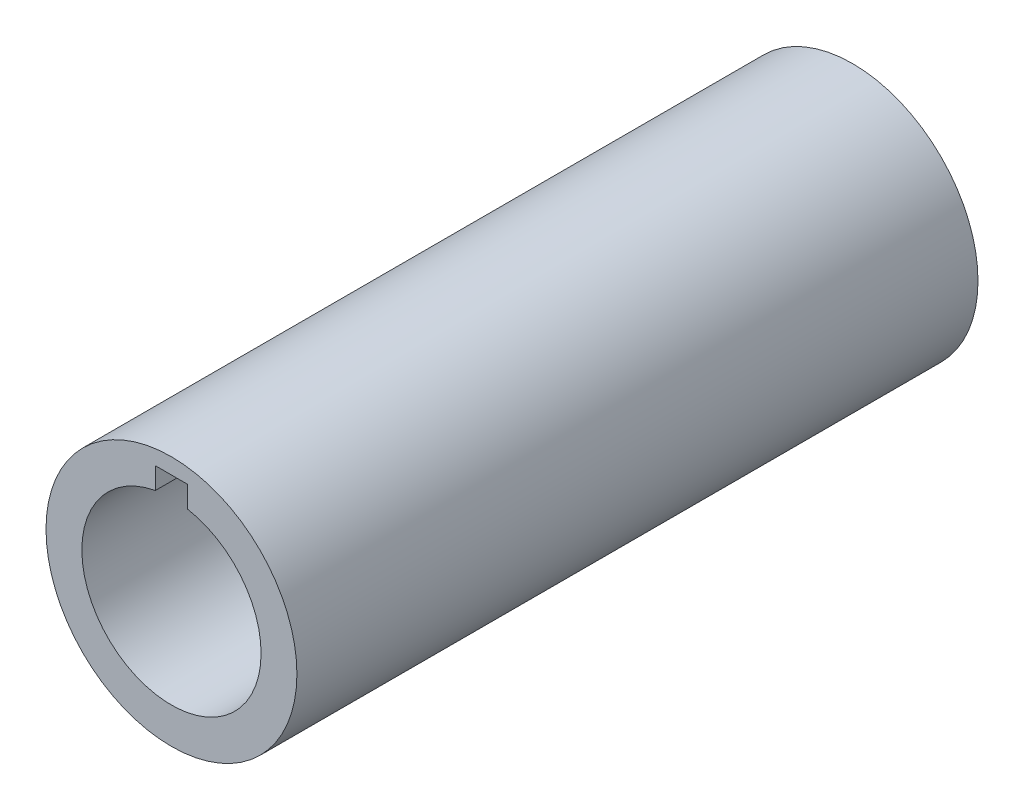
ISO-10303-21;
HEADER;
FILE_DESCRIPTION(('STEP AP214'),'2;1');
FILE_NAME('part.step','',(''),(''),'','','');
FILE_SCHEMA(('AUTOMOTIVE_DESIGN { 1 0 10303 214 1 1 1 1 }'));
ENDSEC;
DATA;
#1=APPLICATION_CONTEXT('core data for automotive mechanical design processes');
#2=APPLICATION_PROTOCOL_DEFINITION('international standard','automotive_design',2000,#1);
#3=PRODUCT_CONTEXT('',#1,'mechanical');
#4=PRODUCT('Part','Part','',(#3));
#5=PRODUCT_RELATED_PRODUCT_CATEGORY('part','',(#4));
#6=PRODUCT_DEFINITION_FORMATION('','',#4);
#7=PRODUCT_DEFINITION_CONTEXT('part definition',#1,'design');
#8=PRODUCT_DEFINITION('design','',#6,#7);
#9=PRODUCT_DEFINITION_SHAPE('','',#8);
#10=(LENGTH_UNIT() NAMED_UNIT(*) SI_UNIT(.MILLI.,.METRE.));
#11=(NAMED_UNIT(*) PLANE_ANGLE_UNIT() SI_UNIT($,.RADIAN.));
#12=(NAMED_UNIT(*) SI_UNIT($,.STERADIAN.) SOLID_ANGLE_UNIT());
#13=UNCERTAINTY_MEASURE_WITH_UNIT(LENGTH_MEASURE(1.E-05),#10,'distance_accuracy_value','');
#14=(GEOMETRIC_REPRESENTATION_CONTEXT(3) GLOBAL_UNCERTAINTY_ASSIGNED_CONTEXT((#13)) GLOBAL_UNIT_ASSIGNED_CONTEXT((#10,
#11,#12)) REPRESENTATION_CONTEXT('',''));
#15=CARTESIAN_POINT('',(0.,0.,0.));
#16=DIRECTION('',(0.,0.,1.));
#17=DIRECTION('',(1.,0.,0.));
#18=AXIS2_PLACEMENT_3D('',#15,#16,#17);
#19=CARTESIAN_POINT('',(-55.1207524379169,48.9482308747321,0.));
#20=DIRECTION('',(0.,0.,1.));
#21=DIRECTION('',(1.,0.,0.));
#22=AXIS2_PLACEMENT_3D('',#19,#20,#21);
#23=PLANE('',#22);
#24=CARTESIAN_POINT('',(-55.1207524379169,48.9482308747321,0.));
#25=DIRECTION('',(0.,0.,1.));
#26=DIRECTION('',(1.,0.,0.));
#27=AXIS2_PLACEMENT_3D('',#24,#25,#26);
#28=CIRCLE('',#27,3.5);
#29=CARTESIAN_POINT('',(-51.6207524379169,48.9482308747321,0.));
#30=VERTEX_POINT('',#29);
#31=EDGE_CURVE('E11',#30,#30,#28,.T.);
#32=ORIENTED_EDGE('',*,*,#31,.F.);
#33=EDGE_LOOP('',(#32));
#34=FACE_BOUND('',#33,.T.);
#35=CARTESIAN_POINT('',(-55.1207524379169,48.9482308747321,0.));
#36=DIRECTION('',(0.,0.,1.));
#37=DIRECTION('',(1.,0.,0.));
#38=AXIS2_PLACEMENT_3D('',#35,#36,#37);
#39=CIRCLE('',#38,2.5);
#40=CARTESIAN_POINT('',(-54.6707524379169,46.4890643492605,0.));
#41=VERTEX_POINT('',#40);
#42=CARTESIAN_POINT('',(-55.5707524379169,46.4890643492605,0.));
#43=VERTEX_POINT('',#42);
#44=EDGE_CURVE('E146',#41,#43,#39,.T.);
#45=ORIENTED_EDGE('',*,*,#44,.T.);
#46=DIRECTION('',(0.,1.,0.));
#47=VECTOR('',#46,1.);
#48=CARTESIAN_POINT('',(-55.5707524379169,46.4890643492605,0.));
#49=LINE('',#48,#47);
#50=CARTESIAN_POINT('',(-55.5707524379169,47.0890643492605,0.));
#51=VERTEX_POINT('',#50);
#52=EDGE_CURVE('E163',#43,#51,#49,.T.);
#53=ORIENTED_EDGE('',*,*,#52,.T.);
#54=DIRECTION('',(1.,0.,0.));
#55=VECTOR('',#54,1.);
#56=CARTESIAN_POINT('',(-55.5707524379169,47.0890643492605,0.));
#57=LINE('',#56,#55);
#58=CARTESIAN_POINT('',(-54.6707524379169,47.0890643492605,0.));
#59=VERTEX_POINT('',#58);
#60=EDGE_CURVE('E166',#51,#59,#57,.T.);
#61=ORIENTED_EDGE('',*,*,#60,.T.);
#62=DIRECTION('',(0.,-1.,0.));
#63=VECTOR('',#62,1.);
#64=CARTESIAN_POINT('',(-54.6707524379169,47.0890643492605,0.));
#65=LINE('',#64,#63);
#66=EDGE_CURVE('E151',#59,#41,#65,.T.);
#67=ORIENTED_EDGE('',*,*,#66,.T.);
#68=EDGE_LOOP('',(#45,#53,#61,#67));
#69=FACE_BOUND('',#68,.T.);
#70=ADVANCED_FACE('F43',(#34,#69),#23,.F.);
#71=CARTESIAN_POINT('',(-55.1207524379169,48.9482308747321,8.));
#72=DIRECTION('',(0.,0.,-1.));
#73=DIRECTION('',(-1.,0.,0.));
#74=AXIS2_PLACEMENT_3D('',#71,#72,#73);
#75=CYLINDRICAL_SURFACE('',#74,3.5);
#76=ORIENTED_EDGE('',*,*,#31,.T.);
#77=EDGE_LOOP('',(#76));
#78=FACE_BOUND('',#77,.T.);
#79=CARTESIAN_POINT('',(-55.1207524379169,48.9482308747321,19.));
#80=DIRECTION('',(0.,0.,1.));
#81=DIRECTION('',(1.,0.,0.));
#82=AXIS2_PLACEMENT_3D('',#79,#80,#81);
#83=CIRCLE('',#82,3.50000000000001);
#84=CARTESIAN_POINT('',(-51.6207524379169,48.9482308747321,19.));
#85=VERTEX_POINT('',#84);
#86=EDGE_CURVE('E122',#85,#85,#83,.T.);
#87=ORIENTED_EDGE('',*,*,#86,.F.);
#88=EDGE_LOOP('',(#87));
#89=FACE_BOUND('',#88,.T.);
#90=ADVANCED_FACE('F45',(#78,#89),#75,.T.);
#91=CARTESIAN_POINT('',(-55.1207524379169,48.9482308747321,8.));
#92=DIRECTION('',(0.,0.,-1.));
#93=DIRECTION('',(-1.,0.,0.));
#94=AXIS2_PLACEMENT_3D('',#91,#92,#93);
#95=CYLINDRICAL_SURFACE('',#94,2.5);
#96=ORIENTED_EDGE('',*,*,#44,.F.);
#97=DIRECTION('',(0.,0.,-1.));
#98=VECTOR('',#97,1.);
#99=CARTESIAN_POINT('',(-54.6707524379169,46.4890643492605,8.));
#100=LINE('',#99,#98);
#101=CARTESIAN_POINT('',(-54.6707524379169,46.4890643492605,8.));
#102=VERTEX_POINT('',#101);
#103=EDGE_CURVE('E160',#102,#41,#100,.T.);
#104=ORIENTED_EDGE('',*,*,#103,.F.);
#105=CARTESIAN_POINT('',(-55.1207524379169,48.9482308747321,8.));
#106=DIRECTION('',(0.,0.,1.));
#107=DIRECTION('',(1.,0.,0.));
#108=AXIS2_PLACEMENT_3D('',#105,#106,#107);
#109=CIRCLE('',#108,2.5);
#110=CARTESIAN_POINT('',(-55.5707524379169,46.4890643492605,8.));
#111=VERTEX_POINT('',#110);
#112=EDGE_CURVE('E147',#102,#111,#109,.T.);
#113=ORIENTED_EDGE('',*,*,#112,.T.);
#114=DIRECTION('',(0.,0.,-1.));
#115=VECTOR('',#114,1.);
#116=CARTESIAN_POINT('',(-55.5707524379169,46.4890643492605,8.));
#117=LINE('',#116,#115);
#118=EDGE_CURVE('E51',#111,#43,#117,.T.);
#119=ORIENTED_EDGE('',*,*,#118,.T.);
#120=EDGE_LOOP('',(#96,#104,#113,#119));
#121=FACE_BOUND('',#120,.T.);
#122=ADVANCED_FACE('F179',(#121),#95,.F.);
#123=CARTESIAN_POINT('',(-55.5707524379169,46.4890643492605,8.));
#124=DIRECTION('',(-1.,0.,0.));
#125=DIRECTION('',(0.,0.,1.));
#126=AXIS2_PLACEMENT_3D('',#123,#124,#125);
#127=PLANE('',#126);
#128=ORIENTED_EDGE('',*,*,#52,.F.);
#129=ORIENTED_EDGE('',*,*,#118,.F.);
#130=DIRECTION('',(0.,1.,0.));
#131=VECTOR('',#130,1.);
#132=CARTESIAN_POINT('',(-55.5707524379169,46.4890643492605,8.));
#133=LINE('',#132,#131);
#134=CARTESIAN_POINT('',(-55.5707524379169,47.0890643492605,8.));
#135=VERTEX_POINT('',#134);
#136=EDGE_CURVE('E150',#111,#135,#133,.T.);
#137=ORIENTED_EDGE('',*,*,#136,.T.);
#138=DIRECTION('',(0.,0.,-1.));
#139=VECTOR('',#138,1.);
#140=CARTESIAN_POINT('',(-55.5707524379169,47.0890643492605,8.));
#141=LINE('',#140,#139);
#142=EDGE_CURVE('E175',#135,#51,#141,.T.);
#143=ORIENTED_EDGE('',*,*,#142,.T.);
#144=EDGE_LOOP('',(#128,#129,#137,#143));
#145=FACE_BOUND('',#144,.T.);
#146=ADVANCED_FACE('F191',(#145),#127,.T.);
#147=CARTESIAN_POINT('',(-55.5707524379169,47.0890643492605,8.));
#148=DIRECTION('',(0.,1.,0.));
#149=DIRECTION('',(0.,0.,1.));
#150=AXIS2_PLACEMENT_3D('',#147,#148,#149);
#151=PLANE('',#150);
#152=ORIENTED_EDGE('',*,*,#60,.F.);
#153=ORIENTED_EDGE('',*,*,#142,.F.);
#154=DIRECTION('',(1.,0.,0.));
#155=VECTOR('',#154,1.);
#156=CARTESIAN_POINT('',(-55.5707524379169,47.0890643492605,8.));
#157=LINE('',#156,#155);
#158=CARTESIAN_POINT('',(-54.6707524379169,47.0890643492605,8.));
#159=VERTEX_POINT('',#158);
#160=EDGE_CURVE('E154',#135,#159,#157,.T.);
#161=ORIENTED_EDGE('',*,*,#160,.T.);
#162=DIRECTION('',(0.,0.,-1.));
#163=VECTOR('',#162,1.);
#164=CARTESIAN_POINT('',(-54.6707524379169,47.0890643492605,8.));
#165=LINE('',#164,#163);
#166=EDGE_CURVE('E173',#159,#59,#165,.T.);
#167=ORIENTED_EDGE('',*,*,#166,.T.);
#168=EDGE_LOOP('',(#152,#153,#161,#167));
#169=FACE_BOUND('',#168,.T.);
#170=ADVANCED_FACE('F193',(#169),#151,.T.);
#171=CARTESIAN_POINT('',(-54.6707524379169,47.0890643492605,8.));
#172=DIRECTION('',(1.,0.,0.));
#173=DIRECTION('',(0.,0.,-1.));
#174=AXIS2_PLACEMENT_3D('',#171,#172,#173);
#175=PLANE('',#174);
#176=ORIENTED_EDGE('',*,*,#66,.F.);
#177=ORIENTED_EDGE('',*,*,#166,.F.);
#178=DIRECTION('',(0.,-1.,0.));
#179=VECTOR('',#178,1.);
#180=CARTESIAN_POINT('',(-54.6707524379169,47.0890643492605,8.));
#181=LINE('',#180,#179);
#182=EDGE_CURVE('E157',#159,#102,#181,.T.);
#183=ORIENTED_EDGE('',*,*,#182,.T.);
#184=ORIENTED_EDGE('',*,*,#103,.T.);
#185=EDGE_LOOP('',(#176,#177,#183,#184));
#186=FACE_BOUND('',#185,.T.);
#187=ADVANCED_FACE('F187',(#186),#175,.T.);
#188=CARTESIAN_POINT('',(-55.1207524379169,48.9482308747321,8.));
#189=DIRECTION('',(0.,0.,1.));
#190=DIRECTION('',(1.,0.,0.));
#191=AXIS2_PLACEMENT_3D('',#188,#189,#190);
#192=PLANE('',#191);
#193=ORIENTED_EDGE('',*,*,#136,.F.);
#194=ORIENTED_EDGE('',*,*,#112,.F.);
#195=ORIENTED_EDGE('',*,*,#182,.F.);
#196=ORIENTED_EDGE('',*,*,#160,.F.);
#197=EDGE_LOOP('',(#193,#194,#195,#196));
#198=FACE_BOUND('',#197,.T.);
#199=ADVANCED_FACE('F189',(#198),#192,.F.);
#200=CARTESIAN_POINT('',(-55.1207524379169,48.9482308747321,19.));
#201=DIRECTION('',(0.,0.,1.));
#202=DIRECTION('',(1.,0.,0.));
#203=AXIS2_PLACEMENT_3D('',#200,#201,#202);
#204=PLANE('',#203);
#205=ORIENTED_EDGE('',*,*,#86,.T.);
#206=EDGE_LOOP('',(#205));
#207=FACE_BOUND('',#206,.T.);
#208=DIRECTION('',(0.,1.,0.));
#209=VECTOR('',#208,1.);
#210=CARTESIAN_POINT('',(-54.6707524379169,52.0073974002037,19.));
#211=LINE('',#210,#209);
#212=CARTESIAN_POINT('',(-54.6707524379169,51.4073974002037,19.));
#213=VERTEX_POINT('',#212);
#214=CARTESIAN_POINT('',(-54.6707524379169,52.0073974002037,19.));
#215=VERTEX_POINT('',#214);
#216=EDGE_CURVE('E116',#213,#215,#211,.T.);
#217=ORIENTED_EDGE('',*,*,#216,.F.);
#218=CARTESIAN_POINT('',(-55.1207524379169,48.9482308747321,19.));
#219=DIRECTION('',(0.,0.,1.));
#220=DIRECTION('',(1.,0.,0.));
#221=AXIS2_PLACEMENT_3D('',#218,#219,#220);
#222=CIRCLE('',#221,2.5);
#223=CARTESIAN_POINT('',(-55.5707524379169,51.4073974002037,19.));
#224=VERTEX_POINT('',#223);
#225=EDGE_CURVE('E107',#224,#213,#222,.T.);
#226=ORIENTED_EDGE('',*,*,#225,.F.);
#227=DIRECTION('',(0.,-1.,0.));
#228=VECTOR('',#227,1.);
#229=CARTESIAN_POINT('',(-55.5707524379169,51.4073974002037,19.));
#230=LINE('',#229,#228);
#231=CARTESIAN_POINT('',(-55.5707524379169,52.0073974002037,19.));
#232=VERTEX_POINT('',#231);
#233=EDGE_CURVE('E130',#232,#224,#230,.T.);
#234=ORIENTED_EDGE('',*,*,#233,.F.);
#235=DIRECTION('',(-1.,0.,0.));
#236=VECTOR('',#235,1.);
#237=CARTESIAN_POINT('',(-55.5707524379169,52.0073974002037,19.));
#238=LINE('',#237,#236);
#239=EDGE_CURVE('E128',#215,#232,#238,.T.);
#240=ORIENTED_EDGE('',*,*,#239,.F.);
#241=EDGE_LOOP('',(#217,#226,#234,#240));
#242=FACE_BOUND('',#241,.T.);
#243=ADVANCED_FACE('F126',(#207,#242),#204,.T.);
#244=CARTESIAN_POINT('',(-55.1207524379169,48.9482308747321,19.));
#245=DIRECTION('',(0.,0.,-1.));
#246=DIRECTION('',(-1.,0.,0.));
#247=AXIS2_PLACEMENT_3D('',#244,#245,#246);
#248=CYLINDRICAL_SURFACE('',#247,2.5);
#249=CARTESIAN_POINT('',(-55.1207524379169,48.9482308747321,9.));
#250=DIRECTION('',(0.,0.,1.));
#251=DIRECTION('',(1.,0.,0.));
#252=AXIS2_PLACEMENT_3D('',#249,#250,#251);
#253=CIRCLE('',#252,2.5);
#254=CARTESIAN_POINT('',(-55.5707524379169,51.4073974002037,9.));
#255=VERTEX_POINT('',#254);
#256=CARTESIAN_POINT('',(-54.6707524379169,51.4073974002037,9.));
#257=VERTEX_POINT('',#256);
#258=EDGE_CURVE('E58',#255,#257,#253,.T.);
#259=ORIENTED_EDGE('',*,*,#258,.F.);
#260=DIRECTION('',(0.,0.,-1.));
#261=VECTOR('',#260,1.);
#262=CARTESIAN_POINT('',(-55.5707524379169,51.4073974002037,19.));
#263=LINE('',#262,#261);
#264=EDGE_CURVE('E112',#224,#255,#263,.T.);
#265=ORIENTED_EDGE('',*,*,#264,.F.);
#266=ORIENTED_EDGE('',*,*,#225,.T.);
#267=DIRECTION('',(0.,0.,-1.));
#268=VECTOR('',#267,1.);
#269=CARTESIAN_POINT('',(-54.6707524379169,51.4073974002037,19.));
#270=LINE('',#269,#268);
#271=EDGE_CURVE('E110',#213,#257,#270,.T.);
#272=ORIENTED_EDGE('',*,*,#271,.T.);
#273=EDGE_LOOP('',(#259,#265,#266,#272));
#274=FACE_BOUND('',#273,.T.);
#275=ADVANCED_FACE('F109',(#274),#248,.F.);
#276=CARTESIAN_POINT('',(-54.6707524379169,52.0073974002037,19.));
#277=DIRECTION('',(-1.,0.,0.));
#278=DIRECTION('',(0.,0.,1.));
#279=AXIS2_PLACEMENT_3D('',#276,#277,#278);
#280=PLANE('',#279);
#281=DIRECTION('',(0.,1.,0.));
#282=VECTOR('',#281,1.);
#283=CARTESIAN_POINT('',(-54.6707524379169,52.0073974002037,9.));
#284=LINE('',#283,#282);
#285=CARTESIAN_POINT('',(-54.6707524379169,52.0073974002037,9.));
#286=VERTEX_POINT('',#285);
#287=EDGE_CURVE('E62',#257,#286,#284,.T.);
#288=ORIENTED_EDGE('',*,*,#287,.F.);
#289=ORIENTED_EDGE('',*,*,#271,.F.);
#290=ORIENTED_EDGE('',*,*,#216,.T.);
#291=DIRECTION('',(0.,0.,-1.));
#292=VECTOR('',#291,1.);
#293=CARTESIAN_POINT('',(-54.6707524379169,52.0073974002037,19.));
#294=LINE('',#293,#292);
#295=EDGE_CURVE('E123',#215,#286,#294,.T.);
#296=ORIENTED_EDGE('',*,*,#295,.T.);
#297=EDGE_LOOP('',(#288,#289,#290,#296));
#298=FACE_BOUND('',#297,.T.);
#299=ADVANCED_FACE('F120',(#298),#280,.T.);
#300=CARTESIAN_POINT('',(-55.5707524379169,52.0073974002037,19.));
#301=DIRECTION('',(0.,-1.,0.));
#302=DIRECTION('',(0.,0.,-1.));
#303=AXIS2_PLACEMENT_3D('',#300,#301,#302);
#304=PLANE('',#303);
#305=DIRECTION('',(-1.,0.,0.));
#306=VECTOR('',#305,1.);
#307=CARTESIAN_POINT('',(-55.5707524379169,52.0073974002037,9.));
#308=LINE('',#307,#306);
#309=CARTESIAN_POINT('',(-55.5707524379169,52.0073974002037,9.));
#310=VERTEX_POINT('',#309);
#311=EDGE_CURVE('E136',#286,#310,#308,.T.);
#312=ORIENTED_EDGE('',*,*,#311,.F.);
#313=ORIENTED_EDGE('',*,*,#295,.F.);
#314=ORIENTED_EDGE('',*,*,#239,.T.);
#315=DIRECTION('',(0.,0.,-1.));
#316=VECTOR('',#315,1.);
#317=CARTESIAN_POINT('',(-55.5707524379169,52.0073974002037,19.));
#318=LINE('',#317,#316);
#319=EDGE_CURVE('E140',#232,#310,#318,.T.);
#320=ORIENTED_EDGE('',*,*,#319,.T.);
#321=EDGE_LOOP('',(#312,#313,#314,#320));
#322=FACE_BOUND('',#321,.T.);
#323=ADVANCED_FACE('F266',(#322),#304,.T.);
#324=CARTESIAN_POINT('',(-55.5707524379169,51.4073974002037,19.));
#325=DIRECTION('',(1.,0.,0.));
#326=DIRECTION('',(0.,0.,-1.));
#327=AXIS2_PLACEMENT_3D('',#324,#325,#326);
#328=PLANE('',#327);
#329=DIRECTION('',(0.,-1.,0.));
#330=VECTOR('',#329,1.);
#331=CARTESIAN_POINT('',(-55.5707524379169,51.4073974002037,9.));
#332=LINE('',#331,#330);
#333=EDGE_CURVE('E117',#310,#255,#332,.T.);
#334=ORIENTED_EDGE('',*,*,#333,.F.);
#335=ORIENTED_EDGE('',*,*,#319,.F.);
#336=ORIENTED_EDGE('',*,*,#233,.T.);
#337=ORIENTED_EDGE('',*,*,#264,.T.);
#338=EDGE_LOOP('',(#334,#335,#336,#337));
#339=FACE_BOUND('',#338,.T.);
#340=ADVANCED_FACE('F257',(#339),#328,.T.);
#341=CARTESIAN_POINT('',(-55.1207524379169,48.9482308747321,9.));
#342=DIRECTION('',(0.,0.,1.));
#343=DIRECTION('',(1.,0.,0.));
#344=AXIS2_PLACEMENT_3D('',#341,#342,#343);
#345=PLANE('',#344);
#346=ORIENTED_EDGE('',*,*,#258,.T.);
#347=ORIENTED_EDGE('',*,*,#287,.T.);
#348=ORIENTED_EDGE('',*,*,#311,.T.);
#349=ORIENTED_EDGE('',*,*,#333,.T.);
#350=EDGE_LOOP('',(#346,#347,#348,#349));
#351=FACE_BOUND('',#350,.T.);
#352=ADVANCED_FACE('F253',(#351),#345,.T.);
#353=CLOSED_SHELL('',(#70,#90,#122,#146,#170,#187,#199,#243,#275,#299,#323,#340,#352));
#354=MANIFOLD_SOLID_BREP('B2',#353);
#355=ADVANCED_BREP_SHAPE_REPRESENTATION('',(#18,#354),#14);
#356=SHAPE_DEFINITION_REPRESENTATION(#9,#355);
ENDSEC;
END-ISO-10303-21;
